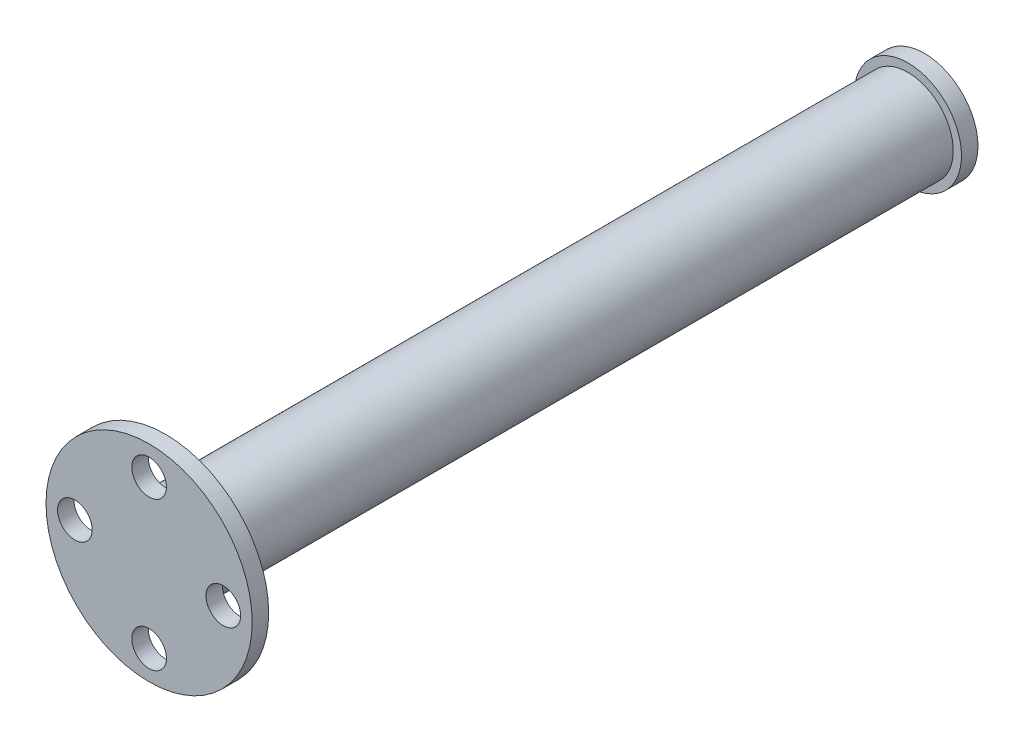
ISO-10303-21;
HEADER;
FILE_DESCRIPTION(('STEP AP214'),'2;1');
FILE_NAME('part.step','',(''),(''),'','','');
FILE_SCHEMA(('AUTOMOTIVE_DESIGN { 1 0 10303 214 1 1 1 1 }'));
ENDSEC;
DATA;
#1=APPLICATION_CONTEXT('core data for automotive mechanical design processes');
#2=APPLICATION_PROTOCOL_DEFINITION('international standard','automotive_design',2000,#1);
#3=PRODUCT_CONTEXT('',#1,'mechanical');
#4=PRODUCT('Part','Part','',(#3));
#5=PRODUCT_RELATED_PRODUCT_CATEGORY('part','',(#4));
#6=PRODUCT_DEFINITION_FORMATION('','',#4);
#7=PRODUCT_DEFINITION_CONTEXT('part definition',#1,'design');
#8=PRODUCT_DEFINITION('design','',#6,#7);
#9=PRODUCT_DEFINITION_SHAPE('','',#8);
#10=(LENGTH_UNIT() NAMED_UNIT(*) SI_UNIT(.MILLI.,.METRE.));
#11=(NAMED_UNIT(*) PLANE_ANGLE_UNIT() SI_UNIT($,.RADIAN.));
#12=(NAMED_UNIT(*) SI_UNIT($,.STERADIAN.) SOLID_ANGLE_UNIT());
#13=UNCERTAINTY_MEASURE_WITH_UNIT(LENGTH_MEASURE(1.E-05),#10,'distance_accuracy_value','');
#14=(GEOMETRIC_REPRESENTATION_CONTEXT(3) GLOBAL_UNCERTAINTY_ASSIGNED_CONTEXT((#13)) GLOBAL_UNIT_ASSIGNED_CONTEXT((#10,
#11,#12)) REPRESENTATION_CONTEXT('',''));
#15=CARTESIAN_POINT('',(0.,0.,0.));
#16=DIRECTION('',(0.,0.,1.));
#17=DIRECTION('',(1.,0.,0.));
#18=AXIS2_PLACEMENT_3D('',#15,#16,#17);
#19=CARTESIAN_POINT('',(0.,0.,92.));
#20=DIRECTION('',(0.,0.,-1.));
#21=DIRECTION('',(-1.,0.,0.));
#22=AXIS2_PLACEMENT_3D('',#19,#20,#21);
#23=CYLINDRICAL_SURFACE('',#22,3.5);
#24=CARTESIAN_POINT('',(0.,0.,2.));
#25=DIRECTION('',(0.,0.,1.));
#26=DIRECTION('',(1.,0.,0.));
#27=AXIS2_PLACEMENT_3D('',#24,#25,#26);
#28=CIRCLE('',#27,3.5);
#29=CARTESIAN_POINT('',(-3.5,0.,1.99999999999999));
#30=VERTEX_POINT('',#29);
#31=EDGE_CURVE('E63',#30,#30,#28,.T.);
#32=CARTESIAN_POINT('',(0.,0.,90.));
#33=DIRECTION('',(0.,0.,1.));
#34=DIRECTION('',(1.,0.,0.));
#35=AXIS2_PLACEMENT_3D('',#32,#33,#34);
#36=CIRCLE('',#35,3.5);
#37=CARTESIAN_POINT('',(-3.5,0.,90.));
#38=VERTEX_POINT('',#37);
#39=EDGE_CURVE('E67',#38,#38,#36,.T.);
#40=CARTESIAN_POINT('',(-3.5,0.,1.99999999999999));
#41=CARTESIAN_POINT('',(-3.5,0.,2.91666666666666));
#42=CARTESIAN_POINT('',(-3.5,0.,3.83333333333332));
#43=CARTESIAN_POINT('',(-3.5,0.,5.66666666666666));
#44=CARTESIAN_POINT('',(-3.5,0.,6.58333333333333));
#45=CARTESIAN_POINT('',(-3.5,0.,8.41666666666666));
#46=CARTESIAN_POINT('',(-3.5,0.,9.33333333333333));
#47=CARTESIAN_POINT('',(-3.5,0.,11.1666666666667));
#48=CARTESIAN_POINT('',(-3.5,0.,12.0833333333333));
#49=CARTESIAN_POINT('',(-3.5,0.,13.9166666666667));
#50=CARTESIAN_POINT('',(-3.5,0.,14.8333333333333));
#51=CARTESIAN_POINT('',(-3.5,0.,16.6666666666667));
#52=CARTESIAN_POINT('',(-3.5,0.,17.5833333333333));
#53=CARTESIAN_POINT('',(-3.5,0.,19.4166666666667));
#54=CARTESIAN_POINT('',(-3.5,0.,20.3333333333333));
#55=CARTESIAN_POINT('',(-3.5,0.,22.1666666666667));
#56=CARTESIAN_POINT('',(-3.5,0.,23.0833333333333));
#57=CARTESIAN_POINT('',(-3.5,0.,24.9166666666667));
#58=CARTESIAN_POINT('',(-3.5,0.,25.8333333333333));
#59=CARTESIAN_POINT('',(-3.5,0.,27.6666666666667));
#60=CARTESIAN_POINT('',(-3.5,0.,28.5833333333333));
#61=CARTESIAN_POINT('',(-3.5,0.,30.4166666666667));
#62=CARTESIAN_POINT('',(-3.5,0.,31.3333333333333));
#63=CARTESIAN_POINT('',(-3.5,0.,33.1666666666667));
#64=CARTESIAN_POINT('',(-3.5,0.,34.0833333333333));
#65=CARTESIAN_POINT('',(-3.5,0.,35.9166666666667));
#66=CARTESIAN_POINT('',(-3.5,0.,36.8333333333333));
#67=CARTESIAN_POINT('',(-3.5,0.,38.6666666666667));
#68=CARTESIAN_POINT('',(-3.5,0.,39.5833333333333));
#69=CARTESIAN_POINT('',(-3.5,0.,41.4166666666667));
#70=CARTESIAN_POINT('',(-3.5,0.,42.3333333333333));
#71=CARTESIAN_POINT('',(-3.5,0.,44.1666666666667));
#72=CARTESIAN_POINT('',(-3.5,0.,45.0833333333333));
#73=CARTESIAN_POINT('',(-3.5,0.,46.9166666666667));
#74=CARTESIAN_POINT('',(-3.5,0.,47.8333333333333));
#75=CARTESIAN_POINT('',(-3.5,0.,49.6666666666667));
#76=CARTESIAN_POINT('',(-3.5,0.,50.5833333333333));
#77=CARTESIAN_POINT('',(-3.5,0.,52.4166666666667));
#78=CARTESIAN_POINT('',(-3.5,0.,53.3333333333333));
#79=CARTESIAN_POINT('',(-3.5,0.,55.1666666666667));
#80=CARTESIAN_POINT('',(-3.5,0.,56.0833333333333));
#81=CARTESIAN_POINT('',(-3.5,0.,57.9166666666667));
#82=CARTESIAN_POINT('',(-3.5,0.,58.8333333333333));
#83=CARTESIAN_POINT('',(-3.5,0.,60.6666666666667));
#84=CARTESIAN_POINT('',(-3.5,0.,61.5833333333333));
#85=CARTESIAN_POINT('',(-3.5,0.,63.4166666666667));
#86=CARTESIAN_POINT('',(-3.5,0.,64.3333333333333));
#87=CARTESIAN_POINT('',(-3.5,0.,66.1666666666666));
#88=CARTESIAN_POINT('',(-3.5,0.,67.0833333333333));
#89=CARTESIAN_POINT('',(-3.5,0.,68.9166666666666));
#90=CARTESIAN_POINT('',(-3.5,0.,69.8333333333333));
#91=CARTESIAN_POINT('',(-3.5,0.,71.6666666666666));
#92=CARTESIAN_POINT('',(-3.5,0.,72.5833333333333));
#93=CARTESIAN_POINT('',(-3.5,0.,74.4166666666666));
#94=CARTESIAN_POINT('',(-3.5,0.,75.3333333333333));
#95=CARTESIAN_POINT('',(-3.5,0.,77.1666666666666));
#96=CARTESIAN_POINT('',(-3.5,0.,78.0833333333333));
#97=CARTESIAN_POINT('',(-3.5,0.,79.9166666666666));
#98=CARTESIAN_POINT('',(-3.5,0.,80.8333333333333));
#99=CARTESIAN_POINT('',(-3.5,0.,82.6666666666666));
#100=CARTESIAN_POINT('',(-3.5,0.,83.5833333333333));
#101=CARTESIAN_POINT('',(-3.5,0.,85.4166666666666));
#102=CARTESIAN_POINT('',(-3.5,0.,86.3333333333333));
#103=CARTESIAN_POINT('',(-3.5,0.,88.1666666666666));
#104=CARTESIAN_POINT('',(-3.5,0.,89.0833333333333));
#105=CARTESIAN_POINT('',(-3.5,0.,90.));
#106=B_SPLINE_CURVE_WITH_KNOTS('',3,(#40,#41,#42,#43,#44,#45,#46,#47,#48,#49,#50,#51,#52,#53,
#54,#55,#56,#57,#58,#59,#60,#61,#62,#63,#64,#65,#66,#67,#68,#69,#70,#71,#72,#73,#74,#75,#76,#77,
#78,#79,#80,#81,#82,#83,#84,#85,#86,#87,#88,#89,#90,#91,#92,#93,#94,#95,#96,#97,#98,#99,#100,
#101,#102,#103,#104,#105),.UNSPECIFIED.,.F.,.F.,(4,2,2,2,2,2,2,2,2,2,2,2,2,2,2,2,2,2,2,2,2,2,2,
2,2,2,2,2,2,2,2,2,4),(0.,2.75,5.50000000000001,8.25000000000001,11.,13.75,16.5,19.25,22.,24.75,
27.5,30.25,33.,35.75,38.5,41.25,44.,46.75,49.5,52.25,55.,57.75,60.5,63.25,66.,68.75,71.5,74.25,
77.,79.75,82.5,85.25,88.),.UNSPECIFIED.);
#107=EDGE_CURVE('BSEAM38',#30,#38,#106,.T.);
#108=ORIENTED_EDGE('',*,*,#31,.F.);
#109=ORIENTED_EDGE('',*,*,#39,.T.);
#110=ORIENTED_EDGE('',*,*,#107,.T.);
#111=ORIENTED_EDGE('',*,*,#107,.F.);
#112=EDGE_LOOP('',(#108,#110,#109,#111));
#113=FACE_BOUND('',#112,.T.);
#114=ADVANCED_FACE('F38',(#113),#23,.F.);
#115=CARTESIAN_POINT('',(0.,0.,2.));
#116=DIRECTION('',(0.,0.,1.));
#117=DIRECTION('',(1.,0.,0.));
#118=AXIS2_PLACEMENT_3D('',#115,#116,#117);
#119=PLANE('',#118);
#120=CARTESIAN_POINT('',(0.,0.,2.));
#121=DIRECTION('',(0.,0.,1.));
#122=DIRECTION('',(1.,0.,0.));
#123=AXIS2_PLACEMENT_3D('',#120,#121,#122);
#124=CIRCLE('',#123,2.5);
#125=CARTESIAN_POINT('',(2.5,0.,2.));
#126=VERTEX_POINT('',#125);
#127=EDGE_CURVE('E55',#126,#126,#124,.T.);
#128=ORIENTED_EDGE('',*,*,#127,.F.);
#129=EDGE_LOOP('',(#128));
#130=FACE_BOUND('',#129,.T.);
#131=ORIENTED_EDGE('',*,*,#31,.T.);
#132=EDGE_LOOP('',(#131));
#133=FACE_BOUND('',#132,.T.);
#134=ADVANCED_FACE('F136',(#130,#133),#119,.T.);
#135=CARTESIAN_POINT('',(0.,0.,2.));
#136=DIRECTION('',(0.,0.,1.));
#137=DIRECTION('',(1.,0.,0.));
#138=AXIS2_PLACEMENT_3D('',#135,#136,#137);
#139=CIRCLE('',#138,5.5);
#140=CARTESIAN_POINT('',(-5.5,0.,1.99999999999999));
#141=VERTEX_POINT('',#140);
#142=EDGE_CURVE('E10',#141,#141,#139,.T.);
#143=ORIENTED_EDGE('',*,*,#142,.F.);
#144=EDGE_LOOP('',(#143));
#145=FACE_BOUND('',#144,.T.);
#146=CARTESIAN_POINT('',(0.,0.,2.));
#147=DIRECTION('',(0.,0.,1.));
#148=DIRECTION('',(1.,0.,0.));
#149=AXIS2_PLACEMENT_3D('',#146,#147,#148);
#150=CIRCLE('',#149,6.5);
#151=CARTESIAN_POINT('',(6.5,0.,2.));
#152=VERTEX_POINT('',#151);
#153=EDGE_CURVE('E46',#152,#152,#150,.T.);
#154=ORIENTED_EDGE('',*,*,#153,.T.);
#155=EDGE_LOOP('',(#154));
#156=FACE_BOUND('',#155,.T.);
#157=ADVANCED_FACE('F142',(#145,#156),#119,.T.);
#158=CARTESIAN_POINT('',(0.,0.,0.));
#159=DIRECTION('',(0.,0.,1.));
#160=DIRECTION('',(1.,0.,0.));
#161=AXIS2_PLACEMENT_3D('',#158,#159,#160);
#162=PLANE('',#161);
#163=CARTESIAN_POINT('',(0.,0.,0.));
#164=DIRECTION('',(0.,0.,1.));
#165=DIRECTION('',(1.,0.,0.));
#166=AXIS2_PLACEMENT_3D('',#163,#164,#165);
#167=CIRCLE('',#166,6.5);
#168=CARTESIAN_POINT('',(6.5,0.,0.));
#169=VERTEX_POINT('',#168);
#170=EDGE_CURVE('E42',#169,#169,#167,.T.);
#171=ORIENTED_EDGE('',*,*,#170,.F.);
#172=EDGE_LOOP('',(#171));
#173=FACE_BOUND('',#172,.T.);
#174=CARTESIAN_POINT('',(0.,0.,0.));
#175=DIRECTION('',(0.,0.,1.));
#176=DIRECTION('',(1.,0.,0.));
#177=AXIS2_PLACEMENT_3D('',#174,#175,#176);
#178=CIRCLE('',#177,2.5);
#179=CARTESIAN_POINT('',(2.5,0.,0.));
#180=VERTEX_POINT('',#179);
#181=EDGE_CURVE('E58',#180,#180,#178,.T.);
#182=ORIENTED_EDGE('',*,*,#181,.T.);
#183=EDGE_LOOP('',(#182));
#184=FACE_BOUND('',#183,.T.);
#185=ADVANCED_FACE('F154',(#173,#184),#162,.F.);
#186=CARTESIAN_POINT('',(0.,0.,2.));
#187=DIRECTION('',(0.,0.,-1.));
#188=DIRECTION('',(-1.,0.,0.));
#189=AXIS2_PLACEMENT_3D('',#186,#187,#188);
#190=CYLINDRICAL_SURFACE('',#189,6.5);
#191=ORIENTED_EDGE('',*,*,#153,.F.);
#192=EDGE_LOOP('',(#191));
#193=FACE_BOUND('',#192,.T.);
#194=ORIENTED_EDGE('',*,*,#170,.T.);
#195=EDGE_LOOP('',(#194));
#196=FACE_BOUND('',#195,.T.);
#197=ADVANCED_FACE('F40',(#193,#196),#190,.T.);
#198=CARTESIAN_POINT('',(0.,0.,2.));
#199=DIRECTION('',(0.,0.,-1.));
#200=DIRECTION('',(-1.,0.,0.));
#201=AXIS2_PLACEMENT_3D('',#198,#199,#200);
#202=CYLINDRICAL_SURFACE('',#201,2.5);
#203=ORIENTED_EDGE('',*,*,#127,.T.);
#204=EDGE_LOOP('',(#203));
#205=FACE_BOUND('',#204,.T.);
#206=ORIENTED_EDGE('',*,*,#181,.F.);
#207=EDGE_LOOP('',(#206));
#208=FACE_BOUND('',#207,.T.);
#209=ADVANCED_FACE('F149',(#205,#208),#202,.F.);
#210=CARTESIAN_POINT('',(0.,0.,92.));
#211=DIRECTION('',(0.,0.,-1.));
#212=DIRECTION('',(-1.,0.,0.));
#213=AXIS2_PLACEMENT_3D('',#210,#211,#212);
#214=CYLINDRICAL_SURFACE('',#213,5.5);
#215=CARTESIAN_POINT('',(0.,0.,92.));
#216=DIRECTION('',(0.,0.,1.));
#217=DIRECTION('',(1.,0.,0.));
#218=AXIS2_PLACEMENT_3D('',#215,#216,#217);
#219=CIRCLE('',#218,5.5);
#220=CARTESIAN_POINT('',(-5.5,0.,92.));
#221=VERTEX_POINT('',#220);
#222=EDGE_CURVE('E53',#221,#221,#219,.T.);
#223=CARTESIAN_POINT('',(-5.5,0.,92.));
#224=CARTESIAN_POINT('',(-5.5,0.,91.0625));
#225=CARTESIAN_POINT('',(-5.5,0.,90.125));
#226=CARTESIAN_POINT('',(-5.5,0.,88.25));
#227=CARTESIAN_POINT('',(-5.5,0.,87.3125));
#228=CARTESIAN_POINT('',(-5.5,0.,85.4375));
#229=CARTESIAN_POINT('',(-5.5,0.,84.5));
#230=CARTESIAN_POINT('',(-5.5,0.,82.625));
#231=CARTESIAN_POINT('',(-5.5,0.,81.6875));
#232=CARTESIAN_POINT('',(-5.5,0.,79.8125));
#233=CARTESIAN_POINT('',(-5.5,0.,78.875));
#234=CARTESIAN_POINT('',(-5.5,0.,77.));
#235=CARTESIAN_POINT('',(-5.5,0.,76.0625));
#236=CARTESIAN_POINT('',(-5.5,0.,74.1875));
#237=CARTESIAN_POINT('',(-5.5,0.,73.25));
#238=CARTESIAN_POINT('',(-5.5,0.,71.375));
#239=CARTESIAN_POINT('',(-5.5,0.,70.4375));
#240=CARTESIAN_POINT('',(-5.5,0.,68.5625));
#241=CARTESIAN_POINT('',(-5.5,0.,67.625));
#242=CARTESIAN_POINT('',(-5.5,0.,65.75));
#243=CARTESIAN_POINT('',(-5.5,0.,64.8125));
#244=CARTESIAN_POINT('',(-5.5,0.,62.9375));
#245=CARTESIAN_POINT('',(-5.5,0.,62.));
#246=CARTESIAN_POINT('',(-5.5,0.,60.125));
#247=CARTESIAN_POINT('',(-5.5,0.,59.1875));
#248=CARTESIAN_POINT('',(-5.5,0.,57.3125));
#249=CARTESIAN_POINT('',(-5.5,0.,56.375));
#250=CARTESIAN_POINT('',(-5.5,0.,54.5));
#251=CARTESIAN_POINT('',(-5.5,0.,53.5625));
#252=CARTESIAN_POINT('',(-5.5,0.,51.6875));
#253=CARTESIAN_POINT('',(-5.5,0.,50.75));
#254=CARTESIAN_POINT('',(-5.5,0.,48.875));
#255=CARTESIAN_POINT('',(-5.5,0.,47.9375));
#256=CARTESIAN_POINT('',(-5.5,0.,46.0625));
#257=CARTESIAN_POINT('',(-5.5,0.,45.125));
#258=CARTESIAN_POINT('',(-5.5,0.,43.25));
#259=CARTESIAN_POINT('',(-5.5,0.,42.3125));
#260=CARTESIAN_POINT('',(-5.5,0.,40.4375));
#261=CARTESIAN_POINT('',(-5.5,0.,39.5));
#262=CARTESIAN_POINT('',(-5.5,0.,37.625));
#263=CARTESIAN_POINT('',(-5.5,0.,36.6875));
#264=CARTESIAN_POINT('',(-5.5,0.,34.8125));
#265=CARTESIAN_POINT('',(-5.5,0.,33.875));
#266=CARTESIAN_POINT('',(-5.5,0.,32.));
#267=CARTESIAN_POINT('',(-5.5,0.,31.0625));
#268=CARTESIAN_POINT('',(-5.5,0.,29.1875));
#269=CARTESIAN_POINT('',(-5.5,0.,28.25));
#270=CARTESIAN_POINT('',(-5.5,0.,26.375));
#271=CARTESIAN_POINT('',(-5.5,0.,25.4375));
#272=CARTESIAN_POINT('',(-5.5,0.,23.5625));
#273=CARTESIAN_POINT('',(-5.5,0.,22.625));
#274=CARTESIAN_POINT('',(-5.5,0.,20.75));
#275=CARTESIAN_POINT('',(-5.5,0.,19.8125));
#276=CARTESIAN_POINT('',(-5.5,0.,17.9375));
#277=CARTESIAN_POINT('',(-5.5,0.,17.));
#278=CARTESIAN_POINT('',(-5.5,0.,15.125));
#279=CARTESIAN_POINT('',(-5.5,0.,14.1875));
#280=CARTESIAN_POINT('',(-5.5,0.,12.3125));
#281=CARTESIAN_POINT('',(-5.5,0.,11.375));
#282=CARTESIAN_POINT('',(-5.5,0.,9.49999999999999));
#283=CARTESIAN_POINT('',(-5.5,0.,8.56249999999999));
#284=CARTESIAN_POINT('',(-5.5,0.,6.68749999999999));
#285=CARTESIAN_POINT('',(-5.5,0.,5.74999999999999));
#286=CARTESIAN_POINT('',(-5.5,0.,3.87499999999999));
#287=CARTESIAN_POINT('',(-5.5,0.,2.93749999999999));
#288=CARTESIAN_POINT('',(-5.5,0.,1.99999999999999));
#289=B_SPLINE_CURVE_WITH_KNOTS('',3,(#223,#224,#225,#226,#227,#228,#229,#230,#231,#232,#233,
#234,#235,#236,#237,#238,#239,#240,#241,#242,#243,#244,#245,#246,#247,#248,#249,#250,#251,#252,
#253,#254,#255,#256,#257,#258,#259,#260,#261,#262,#263,#264,#265,#266,#267,#268,#269,#270,#271,
#272,#273,#274,#275,#276,#277,#278,#279,#280,#281,#282,#283,#284,#285,#286,#287,#288),
.UNSPECIFIED.,.F.,.F.,(4,2,2,2,2,2,2,2,2,2,2,2,2,2,2,2,2,2,2,2,2,2,2,2,2,2,2,2,2,2,2,2,4),(0.,
2.81250000000001,5.62500000000001,8.43750000000001,11.25,14.0625,16.875,19.6875,22.5,25.3125,
28.125,30.9375,33.75,36.5625,39.375,42.1875,45.,47.8125,50.625,53.4375,56.25,59.0625,61.875,
64.6875,67.5,70.3125,73.125,75.9375,78.75,81.5625,84.375,87.1875,90.),.UNSPECIFIED.);
#290=EDGE_CURVE('BSEAM131',#221,#141,#289,.T.);
#291=ORIENTED_EDGE('',*,*,#222,.F.);
#292=ORIENTED_EDGE('',*,*,#142,.T.);
#293=ORIENTED_EDGE('',*,*,#290,.T.);
#294=ORIENTED_EDGE('',*,*,#290,.F.);
#295=EDGE_LOOP('',(#291,#293,#292,#294));
#296=FACE_BOUND('',#295,.T.);
#297=ADVANCED_FACE('F131',(#296),#214,.T.);
#298=CARTESIAN_POINT('',(0.,0.,90.));
#299=DIRECTION('',(0.,0.,1.));
#300=DIRECTION('',(1.,0.,0.));
#301=AXIS2_PLACEMENT_3D('',#298,#299,#300);
#302=PLANE('',#301);
#303=ORIENTED_EDGE('',*,*,#39,.F.);
#304=EDGE_LOOP('',(#303));
#305=FACE_BOUND('',#304,.T.);
#306=ADVANCED_FACE('F122',(#305),#302,.F.);
#307=CARTESIAN_POINT('',(0.,0.,94.));
#308=DIRECTION('',(0.,0.,-1.));
#309=DIRECTION('',(-1.,0.,0.));
#310=AXIS2_PLACEMENT_3D('',#307,#308,#309);
#311=CYLINDRICAL_SURFACE('',#310,12.5);
#312=CARTESIAN_POINT('',(0.,0.,94.));
#313=DIRECTION('',(0.,0.,1.));
#314=DIRECTION('',(1.,0.,0.));
#315=AXIS2_PLACEMENT_3D('',#312,#313,#314);
#316=CIRCLE('',#315,12.5);
#317=CARTESIAN_POINT('',(12.5,0.,94.));
#318=VERTEX_POINT('',#317);
#319=EDGE_CURVE('E71',#318,#318,#316,.T.);
#320=ORIENTED_EDGE('',*,*,#319,.F.);
#321=EDGE_LOOP('',(#320));
#322=FACE_BOUND('',#321,.T.);
#323=CARTESIAN_POINT('',(0.,0.,92.));
#324=DIRECTION('',(0.,0.,1.));
#325=DIRECTION('',(1.,0.,0.));
#326=AXIS2_PLACEMENT_3D('',#323,#324,#325);
#327=CIRCLE('',#326,12.5);
#328=CARTESIAN_POINT('',(12.5,0.,92.));
#329=VERTEX_POINT('',#328);
#330=EDGE_CURVE('E74',#329,#329,#327,.T.);
#331=ORIENTED_EDGE('',*,*,#330,.T.);
#332=EDGE_LOOP('',(#331));
#333=FACE_BOUND('',#332,.T.);
#334=ADVANCED_FACE('F120',(#322,#333),#311,.T.);
#335=CARTESIAN_POINT('',(0.,0.,94.));
#336=DIRECTION('',(0.,0.,1.));
#337=DIRECTION('',(1.,0.,0.));
#338=AXIS2_PLACEMENT_3D('',#335,#336,#337);
#339=PLANE('',#338);
#340=CARTESIAN_POINT('',(0.,9.,94.));
#341=DIRECTION('',(0.,0.,1.));
#342=DIRECTION('',(1.,0.,0.));
#343=AXIS2_PLACEMENT_3D('',#340,#341,#342);
#344=CIRCLE('',#343,2.1);
#345=CARTESIAN_POINT('',(2.1,9.,94.));
#346=VERTEX_POINT('',#345);
#347=EDGE_CURVE('E77',#346,#346,#344,.T.);
#348=ORIENTED_EDGE('',*,*,#347,.F.);
#349=EDGE_LOOP('',(#348));
#350=FACE_BOUND('',#349,.T.);
#351=CARTESIAN_POINT('',(-9.00000000000025,2.54142111694787E-13,94.));
#352=DIRECTION('',(0.,0.,1.));
#353=DIRECTION('',(1.,0.,0.));
#354=AXIS2_PLACEMENT_3D('',#351,#352,#353);
#355=CIRCLE('',#354,2.1000000000002);
#356=CARTESIAN_POINT('',(-6.90000000000005,2.54142111694787E-13,94.));
#357=VERTEX_POINT('',#356);
#358=EDGE_CURVE('E82',#357,#357,#355,.T.);
#359=ORIENTED_EDGE('',*,*,#358,.F.);
#360=EDGE_LOOP('',(#359));
#361=FACE_BOUND('',#360,.T.);
#362=CARTESIAN_POINT('',(-5.08284223389574E-13,-9.,94.));
#363=DIRECTION('',(0.,0.,1.));
#364=DIRECTION('',(1.,0.,0.));
#365=AXIS2_PLACEMENT_3D('',#362,#363,#364);
#366=CIRCLE('',#365,2.10000000000055);
#367=CARTESIAN_POINT('',(2.10000000000004,-9.,94.));
#368=VERTEX_POINT('',#367);
#369=EDGE_CURVE('E85',#368,#368,#366,.T.);
#370=ORIENTED_EDGE('',*,*,#369,.F.);
#371=EDGE_LOOP('',(#370));
#372=FACE_BOUND('',#371,.T.);
#373=CARTESIAN_POINT('',(8.99999999999975,-2.5524429381402E-13,94.));
#374=DIRECTION('',(0.,0.,1.));
#375=DIRECTION('',(1.,0.,0.));
#376=AXIS2_PLACEMENT_3D('',#373,#374,#375);
#377=CIRCLE('',#376,2.10000000000041);
#378=CARTESIAN_POINT('',(11.1000000000002,-2.5524429381402E-13,94.));
#379=VERTEX_POINT('',#378);
#380=EDGE_CURVE('E88',#379,#379,#377,.T.);
#381=ORIENTED_EDGE('',*,*,#380,.F.);
#382=EDGE_LOOP('',(#381));
#383=FACE_BOUND('',#382,.T.);
#384=ORIENTED_EDGE('',*,*,#319,.T.);
#385=EDGE_LOOP('',(#384));
#386=FACE_BOUND('',#385,.T.);
#387=ADVANCED_FACE('F110',(#350,#361,#372,#383,#386),#339,.T.);
#388=CARTESIAN_POINT('',(0.,0.,92.));
#389=DIRECTION('',(0.,0.,1.));
#390=DIRECTION('',(1.,0.,0.));
#391=AXIS2_PLACEMENT_3D('',#388,#389,#390);
#392=PLANE('',#391);
#393=CARTESIAN_POINT('',(0.,9.,92.));
#394=DIRECTION('',(0.,0.,-1.));
#395=DIRECTION('',(-1.,0.,0.));
#396=AXIS2_PLACEMENT_3D('',#393,#394,#395);
#397=CIRCLE('',#396,2.1);
#398=CARTESIAN_POINT('',(-2.1,9.,92.));
#399=VERTEX_POINT('',#398);
#400=EDGE_CURVE('E91',#399,#399,#397,.T.);
#401=ORIENTED_EDGE('',*,*,#400,.F.);
#402=EDGE_LOOP('',(#401));
#403=FACE_BOUND('',#402,.T.);
#404=CARTESIAN_POINT('',(-9.00000000000025,2.54142111694787E-13,92.));
#405=DIRECTION('',(0.,0.,-1.));
#406=DIRECTION('',(-1.,0.,0.));
#407=AXIS2_PLACEMENT_3D('',#404,#405,#406);
#408=CIRCLE('',#407,2.1000000000002);
#409=CARTESIAN_POINT('',(-11.1000000000005,2.54142111694787E-13,92.));
#410=VERTEX_POINT('',#409);
#411=EDGE_CURVE('E98',#410,#410,#408,.T.);
#412=ORIENTED_EDGE('',*,*,#411,.F.);
#413=EDGE_LOOP('',(#412));
#414=FACE_BOUND('',#413,.T.);
#415=CARTESIAN_POINT('',(-5.08284223389574E-13,-9.,92.));
#416=DIRECTION('',(0.,0.,-1.));
#417=DIRECTION('',(-1.,0.,0.));
#418=AXIS2_PLACEMENT_3D('',#415,#416,#417);
#419=CIRCLE('',#418,2.10000000000055);
#420=CARTESIAN_POINT('',(-2.10000000000105,-9.,92.));
#421=VERTEX_POINT('',#420);
#422=EDGE_CURVE('E95',#421,#421,#419,.T.);
#423=ORIENTED_EDGE('',*,*,#422,.F.);
#424=EDGE_LOOP('',(#423));
#425=FACE_BOUND('',#424,.T.);
#426=CARTESIAN_POINT('',(8.99999999999975,-2.5524429381402E-13,92.));
#427=DIRECTION('',(0.,0.,-1.));
#428=DIRECTION('',(-1.,0.,0.));
#429=AXIS2_PLACEMENT_3D('',#426,#427,#428);
#430=CIRCLE('',#429,2.10000000000041);
#431=CARTESIAN_POINT('',(6.89999999999934,-2.5524429381402E-13,92.));
#432=VERTEX_POINT('',#431);
#433=EDGE_CURVE('E92',#432,#432,#430,.T.);
#434=ORIENTED_EDGE('',*,*,#433,.F.);
#435=EDGE_LOOP('',(#434));
#436=FACE_BOUND('',#435,.T.);
#437=ORIENTED_EDGE('',*,*,#222,.T.);
#438=EDGE_LOOP('',(#437));
#439=FACE_BOUND('',#438,.T.);
#440=ORIENTED_EDGE('',*,*,#330,.F.);
#441=EDGE_LOOP('',(#440));
#442=FACE_BOUND('',#441,.T.);
#443=ADVANCED_FACE('F106',(#403,#414,#425,#436,#439,#442),#392,.F.);
#444=CARTESIAN_POINT('',(8.99999999999975,-2.5524429381402E-13,102.));
#445=DIRECTION('',(0.,0.,-1.));
#446=DIRECTION('',(-1.,0.,0.));
#447=AXIS2_PLACEMENT_3D('',#444,#445,#446);
#448=CYLINDRICAL_SURFACE('',#447,2.10000000000041);
#449=ORIENTED_EDGE('',*,*,#380,.T.);
#450=EDGE_LOOP('',(#449));
#451=FACE_BOUND('',#450,.T.);
#452=ORIENTED_EDGE('',*,*,#433,.T.);
#453=EDGE_LOOP('',(#452));
#454=FACE_BOUND('',#453,.T.);
#455=ADVANCED_FACE('F109',(#451,#454),#448,.F.);
#456=CARTESIAN_POINT('',(-5.08284223389574E-13,-9.,102.));
#457=DIRECTION('',(0.,0.,-1.));
#458=DIRECTION('',(-1.,0.,0.));
#459=AXIS2_PLACEMENT_3D('',#456,#457,#458);
#460=CYLINDRICAL_SURFACE('',#459,2.10000000000055);
#461=ORIENTED_EDGE('',*,*,#369,.T.);
#462=EDGE_LOOP('',(#461));
#463=FACE_BOUND('',#462,.T.);
#464=ORIENTED_EDGE('',*,*,#422,.T.);
#465=EDGE_LOOP('',(#464));
#466=FACE_BOUND('',#465,.T.);
#467=ADVANCED_FACE('F210',(#463,#466),#460,.F.);
#468=CARTESIAN_POINT('',(-9.00000000000025,2.54142111694787E-13,102.));
#469=DIRECTION('',(0.,0.,-1.));
#470=DIRECTION('',(-1.,0.,0.));
#471=AXIS2_PLACEMENT_3D('',#468,#469,#470);
#472=CYLINDRICAL_SURFACE('',#471,2.1000000000002);
#473=ORIENTED_EDGE('',*,*,#358,.T.);
#474=EDGE_LOOP('',(#473));
#475=FACE_BOUND('',#474,.T.);
#476=ORIENTED_EDGE('',*,*,#411,.T.);
#477=EDGE_LOOP('',(#476));
#478=FACE_BOUND('',#477,.T.);
#479=ADVANCED_FACE('F220',(#475,#478),#472,.F.);
#480=CARTESIAN_POINT('',(0.,9.,102.));
#481=DIRECTION('',(0.,0.,-1.));
#482=DIRECTION('',(-1.,0.,0.));
#483=AXIS2_PLACEMENT_3D('',#480,#481,#482);
#484=CYLINDRICAL_SURFACE('',#483,2.1);
#485=ORIENTED_EDGE('',*,*,#347,.T.);
#486=EDGE_LOOP('',(#485));
#487=FACE_BOUND('',#486,.T.);
#488=ORIENTED_EDGE('',*,*,#400,.T.);
#489=EDGE_LOOP('',(#488));
#490=FACE_BOUND('',#489,.T.);
#491=ADVANCED_FACE('F104',(#487,#490),#484,.F.);
#492=CLOSED_SHELL('',(#114,#134,#157,#185,#197,#209,#297,#306,#334,#387,#443,#455,#467,#479,#491));
#493=MANIFOLD_SOLID_BREP('B2',#492);
#494=ADVANCED_BREP_SHAPE_REPRESENTATION('',(#18,#493),#14);
#495=SHAPE_DEFINITION_REPRESENTATION(#9,#494);
ENDSEC;
END-ISO-10303-21;
